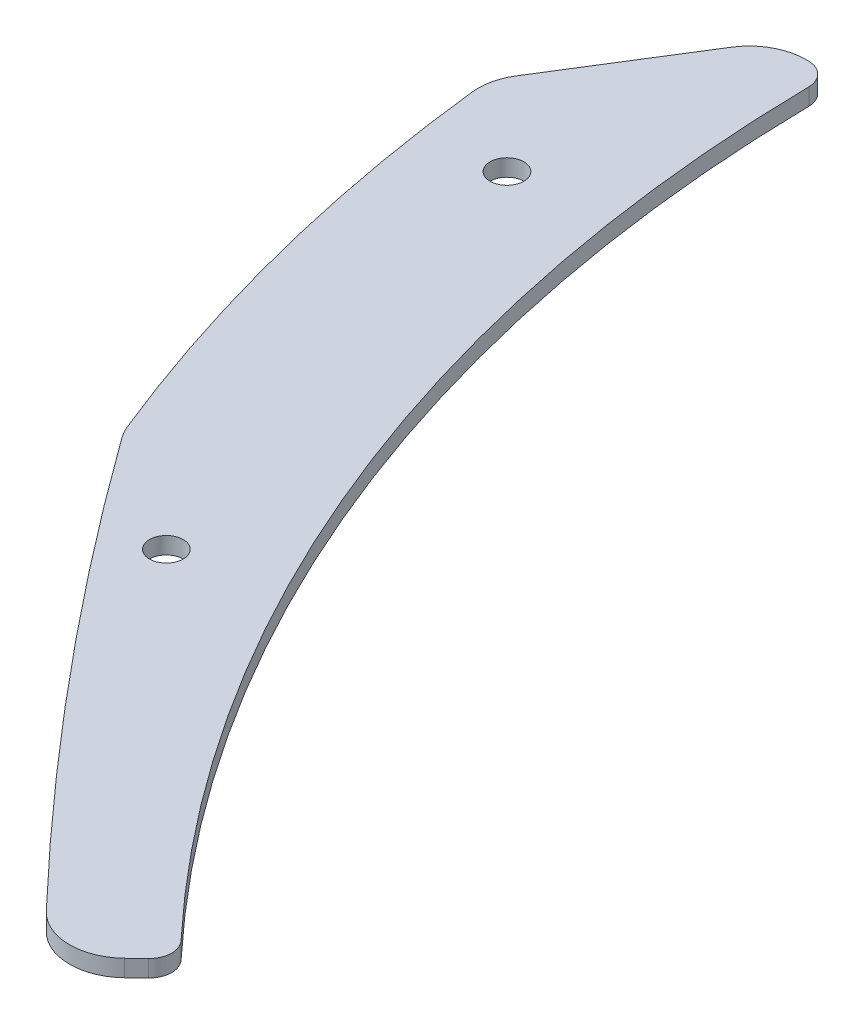
ISO-10303-21;
HEADER;
FILE_DESCRIPTION(('STEP AP214'),'2;1');
FILE_NAME('part.step','',(''),(''),'','','');
FILE_SCHEMA(('AUTOMOTIVE_DESIGN { 1 0 10303 214 1 1 1 1 }'));
ENDSEC;
DATA;
#1=APPLICATION_CONTEXT('core data for automotive mechanical design processes');
#2=APPLICATION_PROTOCOL_DEFINITION('international standard','automotive_design',2000,#1);
#3=PRODUCT_CONTEXT('',#1,'mechanical');
#4=PRODUCT('Part','Part','',(#3));
#5=PRODUCT_RELATED_PRODUCT_CATEGORY('part','',(#4));
#6=PRODUCT_DEFINITION_FORMATION('','',#4);
#7=PRODUCT_DEFINITION_CONTEXT('part definition',#1,'design');
#8=PRODUCT_DEFINITION('design','',#6,#7);
#9=PRODUCT_DEFINITION_SHAPE('','',#8);
#10=(LENGTH_UNIT() NAMED_UNIT(*) SI_UNIT(.MILLI.,.METRE.));
#11=(NAMED_UNIT(*) PLANE_ANGLE_UNIT() SI_UNIT($,.RADIAN.));
#12=(NAMED_UNIT(*) SI_UNIT($,.STERADIAN.) SOLID_ANGLE_UNIT());
#13=UNCERTAINTY_MEASURE_WITH_UNIT(LENGTH_MEASURE(1.E-05),#10,'distance_accuracy_value','');
#14=(GEOMETRIC_REPRESENTATION_CONTEXT(3) GLOBAL_UNCERTAINTY_ASSIGNED_CONTEXT((#13)) GLOBAL_UNIT_ASSIGNED_CONTEXT((#10,
#11,#12)) REPRESENTATION_CONTEXT('',''));
#15=CARTESIAN_POINT('',(0.,0.,0.));
#16=DIRECTION('',(0.,0.,1.));
#17=DIRECTION('',(1.,0.,0.));
#18=AXIS2_PLACEMENT_3D('',#15,#16,#17);
#19=CARTESIAN_POINT('',(0.,1.5,0.));
#20=DIRECTION('',(0.,1.,0.));
#21=DIRECTION('',(0.,0.,1.));
#22=AXIS2_PLACEMENT_3D('',#19,#20,#21);
#23=PLANE('',#22);
#24=CARTESIAN_POINT('',(0.,1.5,0.));
#25=DIRECTION('',(0.,-1.,0.));
#26=DIRECTION('',(0.,0.,1.));
#27=AXIS2_PLACEMENT_3D('',#24,#25,#26);
#28=CIRCLE('',#27,139.5);
#29=CARTESIAN_POINT('',(-101.707557762831,1.5,95.4768175732743));
#30=VERTEX_POINT('',#29);
#31=CARTESIAN_POINT('',(-139.486064806109,1.5,1.97173144876325));
#32=VERTEX_POINT('',#31);
#33=EDGE_CURVE('E202',#30,#32,#28,.T.);
#34=ORIENTED_EDGE('',*,*,#33,.T.);
#35=CARTESIAN_POINT('',(-141.485865018383,1.5,2.));
#36=DIRECTION('',(0.,1.,0.));
#37=DIRECTION('',(0.,0.,1.));
#38=AXIS2_PLACEMENT_3D('',#35,#36,#37);
#39=CIRCLE('',#38,2.);
#40=CARTESIAN_POINT('',(-141.485865018383,1.5,0.));
#41=VERTEX_POINT('',#40);
#42=EDGE_CURVE('E41',#32,#41,#39,.T.);
#43=ORIENTED_EDGE('',*,*,#42,.T.);
#44=DIRECTION('',(-1.,0.,0.));
#45=VECTOR('',#44,1.);
#46=CARTESIAN_POINT('',(-155.,1.5,0.));
#47=LINE('',#46,#45);
#48=CARTESIAN_POINT('',(-141.72797534805,1.5,0.));
#49=VERTEX_POINT('',#48);
#50=EDGE_CURVE('E201',#41,#49,#47,.T.);
#51=ORIENTED_EDGE('',*,*,#50,.T.);
#52=CARTESIAN_POINT('',(-141.72797534805,1.5,5.));
#53=DIRECTION('',(0.,1.,0.));
#54=DIRECTION('',(0.,0.,1.));
#55=AXIS2_PLACEMENT_3D('',#52,#53,#54);
#56=CIRCLE('',#55,5.);
#57=CARTESIAN_POINT('',(-145.968604428838,1.5,2.35102567034455));
#58=VERTEX_POINT('',#57);
#59=EDGE_CURVE('E151',#49,#58,#56,.T.);
#60=ORIENTED_EDGE('',*,*,#59,.T.);
#61=DIRECTION('',(0.529794865931091,0.,-0.848125816157637));
#62=VECTOR('',#61,1.);
#63=CARTESIAN_POINT('',(-144.5,1.5,0.));
#64=LINE('',#63,#62);
#65=CARTESIAN_POINT('',(-153.303391874232,1.5,14.0929714469135));
#66=VERTEX_POINT('',#65);
#67=EDGE_CURVE('E237',#66,#58,#64,.T.);
#68=ORIENTED_EDGE('',*,*,#67,.F.);
#69=CARTESIAN_POINT('',(-149.062762793444,1.5,16.741945776569));
#70=DIRECTION('',(0.,1.,0.));
#71=DIRECTION('',(0.,0.,1.));
#72=AXIS2_PLACEMENT_3D('',#69,#70,#71);
#73=CIRCLE('',#72,5.);
#74=CARTESIAN_POINT('',(-154.031521553225,1.5,17.300010635788));
#75=VERTEX_POINT('',#74);
#76=EDGE_CURVE('E164',#66,#75,#73,.T.);
#77=ORIENTED_EDGE('',*,*,#76,.T.);
#78=CARTESIAN_POINT('',(0.,1.5,0.));
#79=DIRECTION('',(0.,1.,0.));
#80=DIRECTION('',(0.,0.,1.));
#81=AXIS2_PLACEMENT_3D('',#78,#79,#80);
#82=CIRCLE('',#81,155.);
#83=CARTESIAN_POINT('',(-143.591398028419,1.5,58.3653185739959));
#84=VERTEX_POINT('',#83);
#85=EDGE_CURVE('E157',#75,#84,#82,.T.);
#86=ORIENTED_EDGE('',*,*,#85,.T.);
#87=CARTESIAN_POINT('',(-138.959417446857,1.5,56.4825663619315));
#88=DIRECTION('',(0.,1.,0.));
#89=DIRECTION('',(0.,0.,1.));
#90=AXIS2_PLACEMENT_3D('',#87,#88,#89);
#91=CIRCLE('',#90,5.);
#92=CARTESIAN_POINT('',(-143.013559842167,1.5,59.4089855797729));
#93=VERTEX_POINT('',#92);
#94=EDGE_CURVE('E155',#84,#93,#91,.T.);
#95=ORIENTED_EDGE('',*,*,#94,.T.);
#96=CARTESIAN_POINT('',(165.101262201381,1.5,-162.998874976172));
#97=DIRECTION('',(0.,-1.,0.));
#98=DIRECTION('',(0.,0.,1.));
#99=AXIS2_PLACEMENT_3D('',#96,#97,#98);
#100=CIRCLE('',#99,380.);
#101=CARTESIAN_POINT('',(-109.957820532994,1.5,99.1890366546356));
#102=VERTEX_POINT('',#101);
#103=EDGE_CURVE('E245',#102,#93,#100,.T.);
#104=ORIENTED_EDGE('',*,*,#103,.F.);
#105=CARTESIAN_POINT('',(-106.338622075963,1.5,95.739195712125));
#106=DIRECTION('',(0.,1.,0.));
#107=DIRECTION('',(0.,0.,1.));
#108=AXIS2_PLACEMENT_3D('',#105,#106,#107);
#109=CIRCLE('',#108,5.);
#110=CARTESIAN_POINT('',(-102.865330223668,1.5,99.3358947138182));
#111=VERTEX_POINT('',#110);
#112=EDGE_CURVE('E152',#102,#111,#109,.T.);
#113=ORIENTED_EDGE('',*,*,#112,.T.);
#114=DIRECTION('',(0.719339800338653,0.,-0.694658370458995));
#115=VECTOR('',#114,1.);
#116=CARTESIAN_POINT('',(-100.347902147242,1.5,96.9048426790296));
#117=LINE('',#116,#115);
#118=CARTESIAN_POINT('',(-101.776413893065,1.5,98.2843404366509));
#119=VERTEX_POINT('',#118);
#120=EDGE_CURVE('E153',#111,#119,#117,.T.);
#121=ORIENTED_EDGE('',*,*,#120,.T.);
#122=CARTESIAN_POINT('',(-103.165730633983,1.5,96.8456608359736));
#123=DIRECTION('',(0.,1.,0.));
#124=DIRECTION('',(0.,0.,1.));
#125=AXIS2_PLACEMENT_3D('',#122,#123,#124);
#126=CIRCLE('',#125,2.);
#127=EDGE_CURVE('E197',#119,#30,#126,.T.);
#128=ORIENTED_EDGE('',*,*,#127,.T.);
#129=EDGE_LOOP('',(#34,#43,#51,#60,#68,#77,#86,#95,#104,#113,#121,#128));
#130=FACE_BOUND('',#129,.T.);
#131=CARTESIAN_POINT('',(-146.374347777564,1.5,21.8757928471825));
#132=DIRECTION('',(0.,1.,0.));
#133=DIRECTION('',(0.,0.,1.));
#134=AXIS2_PLACEMENT_3D('',#131,#132,#133);
#135=CIRCLE('',#134,1.5);
#136=CARTESIAN_POINT('',(-146.374347777564,1.5,23.3757928471825));
#137=VERTEX_POINT('',#136);
#138=EDGE_CURVE('E209',#137,#137,#135,.T.);
#139=ORIENTED_EDGE('',*,*,#138,.F.);
#140=EDGE_LOOP('',(#139));
#141=FACE_BOUND('',#140,.T.);
#142=CARTESIAN_POINT('',(-132.4502855171,1.5,66.037276340251));
#143=DIRECTION('',(0.,1.,0.));
#144=DIRECTION('',(0.,0.,1.));
#145=AXIS2_PLACEMENT_3D('',#142,#143,#144);
#146=CIRCLE('',#145,1.5);
#147=CARTESIAN_POINT('',(-132.4502855171,1.5,67.537276340251));
#148=VERTEX_POINT('',#147);
#149=EDGE_CURVE('E240',#148,#148,#146,.T.);
#150=ORIENTED_EDGE('',*,*,#149,.F.);
#151=EDGE_LOOP('',(#150));
#152=FACE_BOUND('',#151,.T.);
#153=ADVANCED_FACE('F33',(#130,#141,#152),#23,.T.);
#154=CARTESIAN_POINT('',(0.,0.,0.));
#155=DIRECTION('',(0.,1.,0.));
#156=DIRECTION('',(0.,0.,1.));
#157=AXIS2_PLACEMENT_3D('',#154,#155,#156);
#158=PLANE('',#157);
#159=CARTESIAN_POINT('',(-146.374347777564,0.,21.8757928471825));
#160=DIRECTION('',(0.,1.,0.));
#161=DIRECTION('',(0.,0.,1.));
#162=AXIS2_PLACEMENT_3D('',#159,#160,#161);
#163=CIRCLE('',#162,1.5);
#164=CARTESIAN_POINT('',(-146.374347777564,0.,23.3757928471825));
#165=VERTEX_POINT('',#164);
#166=EDGE_CURVE('E212',#165,#165,#163,.T.);
#167=ORIENTED_EDGE('',*,*,#166,.T.);
#168=EDGE_LOOP('',(#167));
#169=FACE_BOUND('',#168,.T.);
#170=DIRECTION('',(-1.,0.,0.));
#171=VECTOR('',#170,1.);
#172=CARTESIAN_POINT('',(-155.,0.,0.));
#173=LINE('',#172,#171);
#174=CARTESIAN_POINT('',(-141.485865018383,0.,0.));
#175=VERTEX_POINT('',#174);
#176=CARTESIAN_POINT('',(-141.72797534805,0.,0.));
#177=VERTEX_POINT('',#176);
#178=EDGE_CURVE('E125',#175,#177,#173,.T.);
#179=ORIENTED_EDGE('',*,*,#178,.F.);
#180=CARTESIAN_POINT('',(-141.485865018383,0.,2.));
#181=DIRECTION('',(0.,1.,0.));
#182=DIRECTION('',(0.,0.,1.));
#183=AXIS2_PLACEMENT_3D('',#180,#181,#182);
#184=CIRCLE('',#183,2.);
#185=CARTESIAN_POINT('',(-139.486064806109,0.,1.97173144876325));
#186=VERTEX_POINT('',#185);
#187=EDGE_CURVE('E191',#175,#186,#184,.F.);
#188=ORIENTED_EDGE('',*,*,#187,.T.);
#189=CARTESIAN_POINT('',(0.,0.,0.));
#190=DIRECTION('',(0.,-1.,0.));
#191=DIRECTION('',(0.,0.,1.));
#192=AXIS2_PLACEMENT_3D('',#189,#190,#191);
#193=CIRCLE('',#192,139.5);
#194=CARTESIAN_POINT('',(-101.707557762831,0.,95.4768175732743));
#195=VERTEX_POINT('',#194);
#196=EDGE_CURVE('E135',#195,#186,#193,.T.);
#197=ORIENTED_EDGE('',*,*,#196,.F.);
#198=CARTESIAN_POINT('',(-103.165730633983,0.,96.8456608359736));
#199=DIRECTION('',(0.,1.,0.));
#200=DIRECTION('',(0.,0.,1.));
#201=AXIS2_PLACEMENT_3D('',#198,#199,#200);
#202=CIRCLE('',#201,2.);
#203=CARTESIAN_POINT('',(-101.776413893065,0.,98.2843404366509));
#204=VERTEX_POINT('',#203);
#205=EDGE_CURVE('E189',#195,#204,#202,.F.);
#206=ORIENTED_EDGE('',*,*,#205,.T.);
#207=DIRECTION('',(0.719339800338653,0.,-0.694658370458995));
#208=VECTOR('',#207,1.);
#209=CARTESIAN_POINT('',(-100.347902147242,0.,96.9048426790296));
#210=LINE('',#209,#208);
#211=CARTESIAN_POINT('',(-102.865330223668,0.,99.3358947138182));
#212=VERTEX_POINT('',#211);
#213=EDGE_CURVE('E160',#212,#204,#210,.T.);
#214=ORIENTED_EDGE('',*,*,#213,.F.);
#215=CARTESIAN_POINT('',(-106.338622075963,0.,95.739195712125));
#216=DIRECTION('',(0.,1.,0.));
#217=DIRECTION('',(0.,0.,1.));
#218=AXIS2_PLACEMENT_3D('',#215,#216,#217);
#219=CIRCLE('',#218,5.);
#220=CARTESIAN_POINT('',(-109.957820532994,0.,99.1890366546356));
#221=VERTEX_POINT('',#220);
#222=EDGE_CURVE('E172',#212,#221,#219,.F.);
#223=ORIENTED_EDGE('',*,*,#222,.T.);
#224=CARTESIAN_POINT('',(165.101262201381,0.,-162.998874976172));
#225=DIRECTION('',(0.,-1.,0.));
#226=DIRECTION('',(0.,0.,1.));
#227=AXIS2_PLACEMENT_3D('',#224,#225,#226);
#228=CIRCLE('',#227,380.);
#229=CARTESIAN_POINT('',(-143.013559842167,0.,59.4089855797729));
#230=VERTEX_POINT('',#229);
#231=EDGE_CURVE('E242',#221,#230,#228,.T.);
#232=ORIENTED_EDGE('',*,*,#231,.T.);
#233=CARTESIAN_POINT('',(-138.959417446857,0.,56.4825663619315));
#234=DIRECTION('',(0.,1.,0.));
#235=DIRECTION('',(0.,0.,1.));
#236=AXIS2_PLACEMENT_3D('',#233,#234,#235);
#237=CIRCLE('',#236,5.);
#238=CARTESIAN_POINT('',(-143.591398028419,0.,58.3653185739959));
#239=VERTEX_POINT('',#238);
#240=EDGE_CURVE('E174',#230,#239,#237,.F.);
#241=ORIENTED_EDGE('',*,*,#240,.T.);
#242=CARTESIAN_POINT('',(0.,0.,0.));
#243=DIRECTION('',(0.,1.,0.));
#244=DIRECTION('',(0.,0.,1.));
#245=AXIS2_PLACEMENT_3D('',#242,#243,#244);
#246=CIRCLE('',#245,155.);
#247=CARTESIAN_POINT('',(-154.031521553225,0.,17.300010635788));
#248=VERTEX_POINT('',#247);
#249=EDGE_CURVE('E134',#248,#239,#246,.T.);
#250=ORIENTED_EDGE('',*,*,#249,.F.);
#251=CARTESIAN_POINT('',(-149.062762793444,0.,16.741945776569));
#252=DIRECTION('',(0.,1.,0.));
#253=DIRECTION('',(0.,0.,1.));
#254=AXIS2_PLACEMENT_3D('',#251,#252,#253);
#255=CIRCLE('',#254,5.);
#256=CARTESIAN_POINT('',(-153.303391874232,0.,14.0929714469135));
#257=VERTEX_POINT('',#256);
#258=EDGE_CURVE('E147',#248,#257,#255,.F.);
#259=ORIENTED_EDGE('',*,*,#258,.T.);
#260=DIRECTION('',(0.529794865931091,0.,-0.848125816157637));
#261=VECTOR('',#260,1.);
#262=CARTESIAN_POINT('',(-144.5,0.,0.));
#263=LINE('',#262,#261);
#264=CARTESIAN_POINT('',(-145.968604428838,0.,2.35102567034455));
#265=VERTEX_POINT('',#264);
#266=EDGE_CURVE('E143',#257,#265,#263,.T.);
#267=ORIENTED_EDGE('',*,*,#266,.T.);
#268=CARTESIAN_POINT('',(-141.72797534805,0.,5.));
#269=DIRECTION('',(0.,1.,0.));
#270=DIRECTION('',(0.,0.,1.));
#271=AXIS2_PLACEMENT_3D('',#268,#269,#270);
#272=CIRCLE('',#271,5.);
#273=EDGE_CURVE('E139',#265,#177,#272,.F.);
#274=ORIENTED_EDGE('',*,*,#273,.T.);
#275=EDGE_LOOP('',(#179,#188,#197,#206,#214,#223,#232,#241,#250,#259,#267,#274));
#276=FACE_BOUND('',#275,.T.);
#277=CARTESIAN_POINT('',(-132.4502855171,0.,66.037276340251));
#278=DIRECTION('',(0.,1.,0.));
#279=DIRECTION('',(0.,0.,1.));
#280=AXIS2_PLACEMENT_3D('',#277,#278,#279);
#281=CIRCLE('',#280,1.5);
#282=CARTESIAN_POINT('',(-132.4502855171,0.,67.537276340251));
#283=VERTEX_POINT('',#282);
#284=EDGE_CURVE('E236',#283,#283,#281,.T.);
#285=ORIENTED_EDGE('',*,*,#284,.T.);
#286=EDGE_LOOP('',(#285));
#287=FACE_BOUND('',#286,.T.);
#288=ADVANCED_FACE('F140',(#169,#276,#287),#158,.F.);
#289=CARTESIAN_POINT('',(0.,1.5,0.));
#290=DIRECTION('',(0.,-1.,0.));
#291=DIRECTION('',(0.,0.,-1.));
#292=AXIS2_PLACEMENT_3D('',#289,#290,#291);
#293=CYLINDRICAL_SURFACE('',#292,139.5);
#294=ORIENTED_EDGE('',*,*,#196,.T.);
#295=DIRECTION('',(0.,-1.,0.));
#296=VECTOR('',#295,1.);
#297=CARTESIAN_POINT('',(-139.486064806109,1.5,1.97173144876325));
#298=LINE('',#297,#296);
#299=EDGE_CURVE('E54',#186,#32,#298,.F.);
#300=ORIENTED_EDGE('',*,*,#299,.T.);
#301=ORIENTED_EDGE('',*,*,#33,.F.);
#302=DIRECTION('',(0.,-1.,0.));
#303=VECTOR('',#302,1.);
#304=CARTESIAN_POINT('',(-101.707557762831,1.5,95.4768175732743));
#305=LINE('',#304,#303);
#306=EDGE_CURVE('E193',#30,#195,#305,.T.);
#307=ORIENTED_EDGE('',*,*,#306,.T.);
#308=EDGE_LOOP('',(#294,#300,#301,#307));
#309=FACE_BOUND('',#308,.T.);
#310=ADVANCED_FACE('F207',(#309),#293,.F.);
#311=CARTESIAN_POINT('',(-155.,1.5,0.));
#312=DIRECTION('',(0.,0.,1.));
#313=DIRECTION('',(1.,0.,0.));
#314=AXIS2_PLACEMENT_3D('',#311,#312,#313);
#315=PLANE('',#314);
#316=ORIENTED_EDGE('',*,*,#50,.F.);
#317=DIRECTION('',(0.,-1.,0.));
#318=VECTOR('',#317,1.);
#319=CARTESIAN_POINT('',(-141.485865018383,1.5,0.));
#320=LINE('',#319,#318);
#321=EDGE_CURVE('E132',#41,#175,#320,.T.);
#322=ORIENTED_EDGE('',*,*,#321,.T.);
#323=ORIENTED_EDGE('',*,*,#178,.T.);
#324=DIRECTION('',(0.,1.,0.));
#325=VECTOR('',#324,1.);
#326=CARTESIAN_POINT('',(-141.72797534805,1.5,0.));
#327=LINE('',#326,#325);
#328=EDGE_CURVE('E130',#177,#49,#327,.T.);
#329=ORIENTED_EDGE('',*,*,#328,.T.);
#330=EDGE_LOOP('',(#316,#322,#323,#329));
#331=FACE_BOUND('',#330,.T.);
#332=ADVANCED_FACE('F128',(#331),#315,.F.);
#333=CARTESIAN_POINT('',(0.,1.5,0.));
#334=DIRECTION('',(0.,-1.,0.));
#335=DIRECTION('',(0.,0.,-1.));
#336=AXIS2_PLACEMENT_3D('',#333,#334,#335);
#337=CYLINDRICAL_SURFACE('',#336,155.);
#338=ORIENTED_EDGE('',*,*,#85,.F.);
#339=DIRECTION('',(0.,-1.,0.));
#340=VECTOR('',#339,1.);
#341=CARTESIAN_POINT('',(-154.031521553225,1.5,17.300010635788));
#342=LINE('',#341,#340);
#343=EDGE_CURVE('E179',#75,#248,#342,.T.);
#344=ORIENTED_EDGE('',*,*,#343,.T.);
#345=ORIENTED_EDGE('',*,*,#249,.T.);
#346=DIRECTION('',(0.,-1.,0.));
#347=VECTOR('',#346,1.);
#348=CARTESIAN_POINT('',(-143.591398028419,1.5,58.3653185739959));
#349=LINE('',#348,#347);
#350=EDGE_CURVE('E146',#239,#84,#349,.F.);
#351=ORIENTED_EDGE('',*,*,#350,.T.);
#352=EDGE_LOOP('',(#338,#344,#345,#351));
#353=FACE_BOUND('',#352,.T.);
#354=ADVANCED_FACE('F228',(#353),#337,.T.);
#355=CARTESIAN_POINT('',(-100.347902147242,1.5,96.9048426790296));
#356=DIRECTION('',(-0.694658370458995,0.,-0.719339800338653));
#357=DIRECTION('',(-0.719339800338653,0.,0.694658370458995));
#358=AXIS2_PLACEMENT_3D('',#355,#356,#357);
#359=PLANE('',#358);
#360=ORIENTED_EDGE('',*,*,#213,.T.);
#361=DIRECTION('',(0.,-1.,0.));
#362=VECTOR('',#361,1.);
#363=CARTESIAN_POINT('',(-101.776413893065,1.5,98.2843404366509));
#364=LINE('',#363,#362);
#365=EDGE_CURVE('E11',#204,#119,#364,.F.);
#366=ORIENTED_EDGE('',*,*,#365,.T.);
#367=ORIENTED_EDGE('',*,*,#120,.F.);
#368=DIRECTION('',(0.,1.,0.));
#369=VECTOR('',#368,1.);
#370=CARTESIAN_POINT('',(-102.865330223668,1.5,99.3358947138182));
#371=LINE('',#370,#369);
#372=EDGE_CURVE('E186',#111,#212,#371,.F.);
#373=ORIENTED_EDGE('',*,*,#372,.T.);
#374=EDGE_LOOP('',(#360,#366,#367,#373));
#375=FACE_BOUND('',#374,.T.);
#376=ADVANCED_FACE('F258',(#375),#359,.F.);
#377=CARTESIAN_POINT('',(-146.374347777564,1.5,21.8757928471825));
#378=DIRECTION('',(0.,-1.,0.));
#379=DIRECTION('',(0.,0.,-1.));
#380=AXIS2_PLACEMENT_3D('',#377,#378,#379);
#381=CYLINDRICAL_SURFACE('',#380,1.5);
#382=ORIENTED_EDGE('',*,*,#138,.T.);
#383=EDGE_LOOP('',(#382));
#384=FACE_BOUND('',#383,.T.);
#385=ORIENTED_EDGE('',*,*,#166,.F.);
#386=EDGE_LOOP('',(#385));
#387=FACE_BOUND('',#386,.T.);
#388=ADVANCED_FACE('F255',(#384,#387),#381,.F.);
#389=CARTESIAN_POINT('',(-132.4502855171,1.5,66.037276340251));
#390=DIRECTION('',(0.,-1.,0.));
#391=DIRECTION('',(0.,0.,-1.));
#392=AXIS2_PLACEMENT_3D('',#389,#390,#391);
#393=CYLINDRICAL_SURFACE('',#392,1.5);
#394=ORIENTED_EDGE('',*,*,#149,.T.);
#395=EDGE_LOOP('',(#394));
#396=FACE_BOUND('',#395,.T.);
#397=ORIENTED_EDGE('',*,*,#284,.F.);
#398=EDGE_LOOP('',(#397));
#399=FACE_BOUND('',#398,.T.);
#400=ADVANCED_FACE('F257',(#396,#399),#393,.F.);
#401=CARTESIAN_POINT('',(-144.5,0.,0.));
#402=DIRECTION('',(0.848125816157637,0.,0.529794865931091));
#403=DIRECTION('',(0.529794865931091,0.,-0.848125816157637));
#404=AXIS2_PLACEMENT_3D('',#401,#402,#403);
#405=PLANE('',#404);
#406=ORIENTED_EDGE('',*,*,#67,.T.);
#407=DIRECTION('',(0.,1.,0.));
#408=VECTOR('',#407,1.);
#409=CARTESIAN_POINT('',(-145.968604428838,0.,2.35102567034455));
#410=LINE('',#409,#408);
#411=EDGE_CURVE('E170',#58,#265,#410,.F.);
#412=ORIENTED_EDGE('',*,*,#411,.T.);
#413=ORIENTED_EDGE('',*,*,#266,.F.);
#414=DIRECTION('',(0.,-1.,0.));
#415=VECTOR('',#414,1.);
#416=CARTESIAN_POINT('',(-153.303391874232,0.,14.0929714469135));
#417=LINE('',#416,#415);
#418=EDGE_CURVE('E167',#257,#66,#417,.F.);
#419=ORIENTED_EDGE('',*,*,#418,.T.);
#420=EDGE_LOOP('',(#406,#412,#413,#419));
#421=FACE_BOUND('',#420,.T.);
#422=ADVANCED_FACE('F235',(#421),#405,.F.);
#423=CARTESIAN_POINT('',(165.101262201381,0.,-162.998874976172));
#424=DIRECTION('',(0.,1.,0.));
#425=DIRECTION('',(0.,0.,1.));
#426=AXIS2_PLACEMENT_3D('',#423,#424,#425);
#427=CYLINDRICAL_SURFACE('',#426,380.);
#428=ORIENTED_EDGE('',*,*,#103,.T.);
#429=DIRECTION('',(0.,1.,0.));
#430=VECTOR('',#429,1.);
#431=CARTESIAN_POINT('',(-143.013559842167,0.,59.4089855797729));
#432=LINE('',#431,#430);
#433=EDGE_CURVE('E184',#93,#230,#432,.F.);
#434=ORIENTED_EDGE('',*,*,#433,.T.);
#435=ORIENTED_EDGE('',*,*,#231,.F.);
#436=DIRECTION('',(0.,1.,0.));
#437=VECTOR('',#436,1.);
#438=CARTESIAN_POINT('',(-109.957820532994,0.,99.1890366546356));
#439=LINE('',#438,#437);
#440=EDGE_CURVE('E181',#221,#102,#439,.T.);
#441=ORIENTED_EDGE('',*,*,#440,.T.);
#442=EDGE_LOOP('',(#428,#434,#435,#441));
#443=FACE_BOUND('',#442,.T.);
#444=ADVANCED_FACE('F282',(#443),#427,.T.);
#445=CARTESIAN_POINT('',(-141.72797534805,1.5,5.));
#446=DIRECTION('',(0.,1.,0.));
#447=DIRECTION('',(0.,0.,1.));
#448=AXIS2_PLACEMENT_3D('',#445,#446,#447);
#449=CYLINDRICAL_SURFACE('',#448,5.);
#450=ORIENTED_EDGE('',*,*,#273,.F.);
#451=ORIENTED_EDGE('',*,*,#411,.F.);
#452=ORIENTED_EDGE('',*,*,#59,.F.);
#453=ORIENTED_EDGE('',*,*,#328,.F.);
#454=EDGE_LOOP('',(#450,#451,#452,#453));
#455=FACE_BOUND('',#454,.T.);
#456=ADVANCED_FACE('F150',(#455),#449,.T.);
#457=CARTESIAN_POINT('',(-149.062762793444,1.5,16.741945776569));
#458=DIRECTION('',(0.,-1.,0.));
#459=DIRECTION('',(0.,0.,-1.));
#460=AXIS2_PLACEMENT_3D('',#457,#458,#459);
#461=CYLINDRICAL_SURFACE('',#460,5.);
#462=ORIENTED_EDGE('',*,*,#258,.F.);
#463=ORIENTED_EDGE('',*,*,#343,.F.);
#464=ORIENTED_EDGE('',*,*,#76,.F.);
#465=ORIENTED_EDGE('',*,*,#418,.F.);
#466=EDGE_LOOP('',(#462,#463,#464,#465));
#467=FACE_BOUND('',#466,.T.);
#468=ADVANCED_FACE('F231',(#467),#461,.T.);
#469=CARTESIAN_POINT('',(-138.959417446857,0.,56.4825663619315));
#470=DIRECTION('',(0.,1.,0.));
#471=DIRECTION('',(0.,0.,1.));
#472=AXIS2_PLACEMENT_3D('',#469,#470,#471);
#473=CYLINDRICAL_SURFACE('',#472,5.);
#474=ORIENTED_EDGE('',*,*,#240,.F.);
#475=ORIENTED_EDGE('',*,*,#433,.F.);
#476=ORIENTED_EDGE('',*,*,#94,.F.);
#477=ORIENTED_EDGE('',*,*,#350,.F.);
#478=EDGE_LOOP('',(#474,#475,#476,#477));
#479=FACE_BOUND('',#478,.T.);
#480=ADVANCED_FACE('F285',(#479),#473,.T.);
#481=CARTESIAN_POINT('',(-106.338622075963,0.,95.739195712125));
#482=DIRECTION('',(0.,1.,0.));
#483=DIRECTION('',(0.,0.,1.));
#484=AXIS2_PLACEMENT_3D('',#481,#482,#483);
#485=CYLINDRICAL_SURFACE('',#484,5.);
#486=ORIENTED_EDGE('',*,*,#222,.F.);
#487=ORIENTED_EDGE('',*,*,#372,.F.);
#488=ORIENTED_EDGE('',*,*,#112,.F.);
#489=ORIENTED_EDGE('',*,*,#440,.F.);
#490=EDGE_LOOP('',(#486,#487,#488,#489));
#491=FACE_BOUND('',#490,.T.);
#492=ADVANCED_FACE('F288',(#491),#485,.T.);
#493=CARTESIAN_POINT('',(-141.485865018383,1.5,2.));
#494=DIRECTION('',(0.,-1.,0.));
#495=DIRECTION('',(0.,0.,-1.));
#496=AXIS2_PLACEMENT_3D('',#493,#494,#495);
#497=CYLINDRICAL_SURFACE('',#496,2.);
#498=ORIENTED_EDGE('',*,*,#42,.F.);
#499=ORIENTED_EDGE('',*,*,#299,.F.);
#500=ORIENTED_EDGE('',*,*,#187,.F.);
#501=ORIENTED_EDGE('',*,*,#321,.F.);
#502=EDGE_LOOP('',(#498,#499,#500,#501));
#503=FACE_BOUND('',#502,.T.);
#504=ADVANCED_FACE('F205',(#503),#497,.T.);
#505=CARTESIAN_POINT('',(-103.165730633983,1.5,96.8456608359736));
#506=DIRECTION('',(0.,-1.,0.));
#507=DIRECTION('',(0.,0.,-1.));
#508=AXIS2_PLACEMENT_3D('',#505,#506,#507);
#509=CYLINDRICAL_SURFACE('',#508,2.);
#510=ORIENTED_EDGE('',*,*,#127,.F.);
#511=ORIENTED_EDGE('',*,*,#365,.F.);
#512=ORIENTED_EDGE('',*,*,#205,.F.);
#513=ORIENTED_EDGE('',*,*,#306,.F.);
#514=EDGE_LOOP('',(#510,#511,#512,#513));
#515=FACE_BOUND('',#514,.T.);
#516=ADVANCED_FACE('F35',(#515),#509,.T.);
#517=CLOSED_SHELL('',(#153,#288,#310,#332,#354,#376,#388,#400,#422,#444,#456,#468,#480,#492,
#504,#516));
#518=MANIFOLD_SOLID_BREP('B2',#517);
#519=ADVANCED_BREP_SHAPE_REPRESENTATION('',(#18,#518),#14);
#520=SHAPE_DEFINITION_REPRESENTATION(#9,#519);
ENDSEC;
END-ISO-10303-21;
